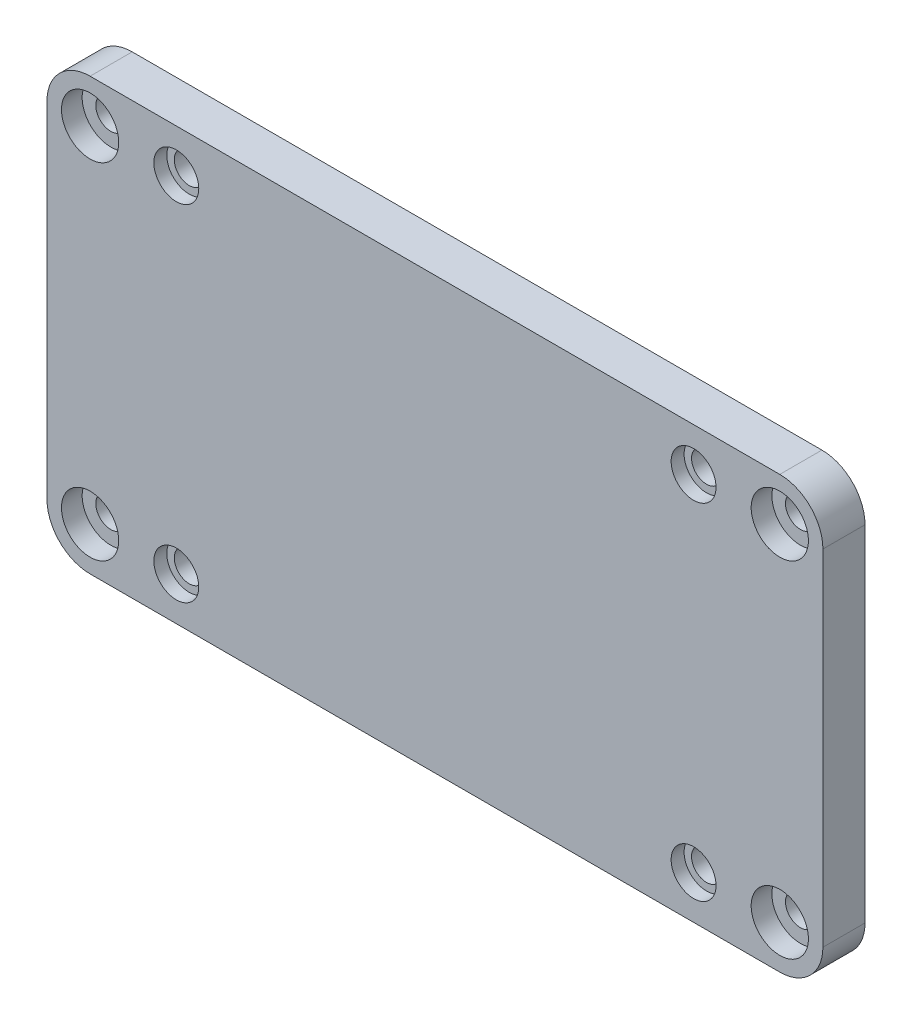
ISO-10303-21;
HEADER;
FILE_DESCRIPTION(('STEP AP214'),'2;1');
FILE_NAME('part.step','',(''),(''),'','','');
FILE_SCHEMA(('AUTOMOTIVE_DESIGN { 1 0 10303 214 1 1 1 1 }'));
ENDSEC;
DATA;
#1=APPLICATION_CONTEXT('core data for automotive mechanical design processes');
#2=APPLICATION_PROTOCOL_DEFINITION('international standard','automotive_design',2000,#1);
#3=PRODUCT_CONTEXT('',#1,'mechanical');
#4=PRODUCT('Part','Part','',(#3));
#5=PRODUCT_RELATED_PRODUCT_CATEGORY('part','',(#4));
#6=PRODUCT_DEFINITION_FORMATION('','',#4);
#7=PRODUCT_DEFINITION_CONTEXT('part definition',#1,'design');
#8=PRODUCT_DEFINITION('design','',#6,#7);
#9=PRODUCT_DEFINITION_SHAPE('','',#8);
#10=(LENGTH_UNIT() NAMED_UNIT(*) SI_UNIT(.MILLI.,.METRE.));
#11=(NAMED_UNIT(*) PLANE_ANGLE_UNIT() SI_UNIT($,.RADIAN.));
#12=(NAMED_UNIT(*) SI_UNIT($,.STERADIAN.) SOLID_ANGLE_UNIT());
#13=UNCERTAINTY_MEASURE_WITH_UNIT(LENGTH_MEASURE(1.E-05),#10,'distance_accuracy_value','');
#14=(GEOMETRIC_REPRESENTATION_CONTEXT(3) GLOBAL_UNCERTAINTY_ASSIGNED_CONTEXT((#13)) GLOBAL_UNIT_ASSIGNED_CONTEXT((#10,
#11,#12)) REPRESENTATION_CONTEXT('',''));
#15=CARTESIAN_POINT('',(0.,0.,0.));
#16=DIRECTION('',(0.,0.,1.));
#17=DIRECTION('',(1.,0.,0.));
#18=AXIS2_PLACEMENT_3D('',#15,#16,#17);
#19=CARTESIAN_POINT('',(-38.1,25.4,0.));
#20=DIRECTION('',(0.,0.,1.));
#21=DIRECTION('',(1.,0.,0.));
#22=AXIS2_PLACEMENT_3D('',#19,#20,#21);
#23=CYLINDRICAL_SURFACE('',#22,2.2098);
#24=CARTESIAN_POINT('',(-38.1,25.4,0.));
#25=DIRECTION('',(0.,0.,1.));
#26=DIRECTION('',(1.,0.,0.));
#27=AXIS2_PLACEMENT_3D('',#24,#25,#26);
#28=CIRCLE('',#27,2.2098);
#29=CARTESIAN_POINT('',(-35.8902,25.4,0.));
#30=VERTEX_POINT('',#29);
#31=EDGE_CURVE('E235',#30,#30,#28,.T.);
#32=ORIENTED_EDGE('',*,*,#31,.F.);
#33=EDGE_LOOP('',(#32));
#34=FACE_BOUND('',#33,.T.);
#35=CARTESIAN_POINT('',(-38.1,25.4,4.296000044));
#36=DIRECTION('',(0.,0.,1.));
#37=DIRECTION('',(1.,0.,0.));
#38=AXIS2_PLACEMENT_3D('',#35,#36,#37);
#39=CIRCLE('',#38,2.2098);
#40=CARTESIAN_POINT('',(-35.8902,25.4,4.296000044));
#41=VERTEX_POINT('',#40);
#42=EDGE_CURVE('E46',#41,#41,#39,.F.);
#43=ORIENTED_EDGE('',*,*,#42,.F.);
#44=EDGE_LOOP('',(#43));
#45=FACE_BOUND('',#44,.T.);
#46=ADVANCED_FACE('F42',(#34,#45),#23,.F.);
#47=CARTESIAN_POINT('',(38.1,25.4,0.));
#48=DIRECTION('',(0.,0.,1.));
#49=DIRECTION('',(1.,0.,0.));
#50=AXIS2_PLACEMENT_3D('',#47,#48,#49);
#51=CYLINDRICAL_SURFACE('',#50,2.2098);
#52=CARTESIAN_POINT('',(38.1,25.4,0.));
#53=DIRECTION('',(0.,0.,1.));
#54=DIRECTION('',(-1.,0.,0.));
#55=AXIS2_PLACEMENT_3D('',#52,#53,#54);
#56=CIRCLE('',#55,2.2098);
#57=CARTESIAN_POINT('',(35.8902,25.4,0.));
#58=VERTEX_POINT('',#57);
#59=EDGE_CURVE('E231',#58,#58,#56,.T.);
#60=ORIENTED_EDGE('',*,*,#59,.F.);
#61=EDGE_LOOP('',(#60));
#62=FACE_BOUND('',#61,.T.);
#63=CARTESIAN_POINT('',(38.1,25.4,4.296000044));
#64=DIRECTION('',(0.,0.,1.));
#65=DIRECTION('',(1.,0.,0.));
#66=AXIS2_PLACEMENT_3D('',#63,#64,#65);
#67=CIRCLE('',#66,2.2098);
#68=CARTESIAN_POINT('',(40.3098,25.4,4.296000044));
#69=VERTEX_POINT('',#68);
#70=EDGE_CURVE('E213',#69,#69,#67,.F.);
#71=ORIENTED_EDGE('',*,*,#70,.F.);
#72=EDGE_LOOP('',(#71));
#73=FACE_BOUND('',#72,.T.);
#74=ADVANCED_FACE('F368',(#62,#73),#51,.F.);
#75=CARTESIAN_POINT('',(38.1,-25.4,0.));
#76=DIRECTION('',(0.,0.,1.));
#77=DIRECTION('',(1.,0.,0.));
#78=AXIS2_PLACEMENT_3D('',#75,#76,#77);
#79=CYLINDRICAL_SURFACE('',#78,2.2098);
#80=CARTESIAN_POINT('',(38.1,-25.4,0.));
#81=DIRECTION('',(0.,0.,1.));
#82=DIRECTION('',(1.,0.,0.));
#83=AXIS2_PLACEMENT_3D('',#80,#81,#82);
#84=CIRCLE('',#83,2.2098);
#85=CARTESIAN_POINT('',(40.3098,-25.4,0.));
#86=VERTEX_POINT('',#85);
#87=EDGE_CURVE('E225',#86,#86,#84,.T.);
#88=ORIENTED_EDGE('',*,*,#87,.F.);
#89=EDGE_LOOP('',(#88));
#90=FACE_BOUND('',#89,.T.);
#91=CARTESIAN_POINT('',(38.1,-25.4,4.296000044));
#92=DIRECTION('',(0.,0.,1.));
#93=DIRECTION('',(1.,0.,0.));
#94=AXIS2_PLACEMENT_3D('',#91,#92,#93);
#95=CIRCLE('',#94,2.2098);
#96=CARTESIAN_POINT('',(40.3098,-25.4,4.296000044));
#97=VERTEX_POINT('',#96);
#98=EDGE_CURVE('E209',#97,#97,#95,.F.);
#99=ORIENTED_EDGE('',*,*,#98,.F.);
#100=EDGE_LOOP('',(#99));
#101=FACE_BOUND('',#100,.T.);
#102=ADVANCED_FACE('F375',(#90,#101),#79,.F.);
#103=CARTESIAN_POINT('',(-38.1,-25.4,0.));
#104=DIRECTION('',(0.,0.,1.));
#105=DIRECTION('',(1.,0.,0.));
#106=AXIS2_PLACEMENT_3D('',#103,#104,#105);
#107=CYLINDRICAL_SURFACE('',#106,2.2098);
#108=CARTESIAN_POINT('',(-38.1,-25.4,0.));
#109=DIRECTION('',(0.,0.,1.));
#110=DIRECTION('',(-1.,0.,0.));
#111=AXIS2_PLACEMENT_3D('',#108,#109,#110);
#112=CIRCLE('',#111,2.2098);
#113=CARTESIAN_POINT('',(-40.3098,-25.4,0.));
#114=VERTEX_POINT('',#113);
#115=EDGE_CURVE('E220',#114,#114,#112,.T.);
#116=ORIENTED_EDGE('',*,*,#115,.F.);
#117=EDGE_LOOP('',(#116));
#118=FACE_BOUND('',#117,.T.);
#119=CARTESIAN_POINT('',(-38.1,-25.4,4.296000044));
#120=DIRECTION('',(0.,0.,1.));
#121=DIRECTION('',(1.,0.,0.));
#122=AXIS2_PLACEMENT_3D('',#119,#120,#121);
#123=CIRCLE('',#122,2.2098);
#124=CARTESIAN_POINT('',(-35.8902,-25.4,4.296000044));
#125=VERTEX_POINT('',#124);
#126=EDGE_CURVE('E205',#125,#125,#123,.F.);
#127=ORIENTED_EDGE('',*,*,#126,.F.);
#128=EDGE_LOOP('',(#127));
#129=FACE_BOUND('',#128,.T.);
#130=ADVANCED_FACE('F382',(#118,#129),#107,.F.);
#131=CARTESIAN_POINT('',(-50.8,-25.4,6.20300004));
#132=DIRECTION('',(0.,0.,-1.));
#133=DIRECTION('',(-1.,0.,0.));
#134=AXIS2_PLACEMENT_3D('',#131,#132,#133);
#135=CYLINDRICAL_SURFACE('',#134,2.2098);
#136=CARTESIAN_POINT('',(-50.8,-25.4,0.));
#137=DIRECTION('',(0.,0.,1.));
#138=DIRECTION('',(1.,0.,0.));
#139=AXIS2_PLACEMENT_3D('',#136,#137,#138);
#140=CIRCLE('',#139,2.2098);
#141=CARTESIAN_POINT('',(-48.5902,-25.4,0.));
#142=VERTEX_POINT('',#141);
#143=EDGE_CURVE('E151',#142,#142,#140,.T.);
#144=ORIENTED_EDGE('',*,*,#143,.F.);
#145=EDGE_LOOP('',(#144));
#146=FACE_BOUND('',#145,.T.);
#147=CARTESIAN_POINT('',(-50.8,-25.4,3.15500004));
#148=DIRECTION('',(0.,0.,1.));
#149=DIRECTION('',(1.,0.,0.));
#150=AXIS2_PLACEMENT_3D('',#147,#148,#149);
#151=CIRCLE('',#150,2.2098);
#152=CARTESIAN_POINT('',(-48.5902,-25.4,3.15500004));
#153=VERTEX_POINT('',#152);
#154=EDGE_CURVE('E200',#153,#153,#151,.T.);
#155=ORIENTED_EDGE('',*,*,#154,.T.);
#156=EDGE_LOOP('',(#155));
#157=FACE_BOUND('',#156,.T.);
#158=ADVANCED_FACE('F415',(#146,#157),#135,.F.);
#159=CARTESIAN_POINT('',(-50.8,25.4,6.20300004));
#160=DIRECTION('',(0.,0.,-1.));
#161=DIRECTION('',(-1.,0.,0.));
#162=AXIS2_PLACEMENT_3D('',#159,#160,#161);
#163=CYLINDRICAL_SURFACE('',#162,2.2098);
#164=CARTESIAN_POINT('',(-50.8,25.4,0.));
#165=DIRECTION('',(0.,0.,1.));
#166=DIRECTION('',(1.,0.,0.));
#167=AXIS2_PLACEMENT_3D('',#164,#165,#166);
#168=CIRCLE('',#167,2.2098);
#169=CARTESIAN_POINT('',(-48.5902,25.4,0.));
#170=VERTEX_POINT('',#169);
#171=EDGE_CURVE('E277',#170,#170,#168,.T.);
#172=ORIENTED_EDGE('',*,*,#171,.F.);
#173=EDGE_LOOP('',(#172));
#174=FACE_BOUND('',#173,.T.);
#175=CARTESIAN_POINT('',(-50.8,25.4,3.15500004));
#176=DIRECTION('',(0.,0.,1.));
#177=DIRECTION('',(1.,0.,0.));
#178=AXIS2_PLACEMENT_3D('',#175,#176,#177);
#179=CIRCLE('',#178,2.2098);
#180=CARTESIAN_POINT('',(-48.5902,25.4,3.15500004));
#181=VERTEX_POINT('',#180);
#182=EDGE_CURVE('E196',#181,#181,#179,.T.);
#183=ORIENTED_EDGE('',*,*,#182,.T.);
#184=EDGE_LOOP('',(#183));
#185=FACE_BOUND('',#184,.T.);
#186=ADVANCED_FACE('F417',(#174,#185),#163,.F.);
#187=CARTESIAN_POINT('',(50.8,25.4,6.20300004));
#188=DIRECTION('',(0.,0.,-1.));
#189=DIRECTION('',(-1.,0.,0.));
#190=AXIS2_PLACEMENT_3D('',#187,#188,#189);
#191=CYLINDRICAL_SURFACE('',#190,2.2098);
#192=CARTESIAN_POINT('',(50.8,25.4,0.));
#193=DIRECTION('',(0.,0.,1.));
#194=DIRECTION('',(1.,0.,0.));
#195=AXIS2_PLACEMENT_3D('',#192,#193,#194);
#196=CIRCLE('',#195,2.2098);
#197=CARTESIAN_POINT('',(53.0098,25.4,0.));
#198=VERTEX_POINT('',#197);
#199=EDGE_CURVE('E273',#198,#198,#196,.T.);
#200=ORIENTED_EDGE('',*,*,#199,.F.);
#201=EDGE_LOOP('',(#200));
#202=FACE_BOUND('',#201,.T.);
#203=CARTESIAN_POINT('',(50.8,25.4,3.15500004));
#204=DIRECTION('',(0.,0.,1.));
#205=DIRECTION('',(1.,0.,0.));
#206=AXIS2_PLACEMENT_3D('',#203,#204,#205);
#207=CIRCLE('',#206,2.2098);
#208=CARTESIAN_POINT('',(53.0098,25.4,3.15500004));
#209=VERTEX_POINT('',#208);
#210=EDGE_CURVE('E191',#209,#209,#207,.T.);
#211=ORIENTED_EDGE('',*,*,#210,.T.);
#212=EDGE_LOOP('',(#211));
#213=FACE_BOUND('',#212,.T.);
#214=ADVANCED_FACE('F423',(#202,#213),#191,.F.);
#215=CARTESIAN_POINT('',(50.8,-25.4,6.20300004));
#216=DIRECTION('',(0.,0.,-1.));
#217=DIRECTION('',(-1.,0.,0.));
#218=AXIS2_PLACEMENT_3D('',#215,#216,#217);
#219=CYLINDRICAL_SURFACE('',#218,2.2098);
#220=CARTESIAN_POINT('',(50.8,-25.4,0.));
#221=DIRECTION('',(0.,0.,1.));
#222=DIRECTION('',(1.,0.,0.));
#223=AXIS2_PLACEMENT_3D('',#220,#221,#222);
#224=CIRCLE('',#223,2.2098);
#225=CARTESIAN_POINT('',(53.0098,-25.4,0.));
#226=VERTEX_POINT('',#225);
#227=EDGE_CURVE('E204',#226,#226,#224,.T.);
#228=ORIENTED_EDGE('',*,*,#227,.F.);
#229=EDGE_LOOP('',(#228));
#230=FACE_BOUND('',#229,.T.);
#231=CARTESIAN_POINT('',(50.8,-25.4,3.15500004));
#232=DIRECTION('',(0.,0.,1.));
#233=DIRECTION('',(1.,0.,0.));
#234=AXIS2_PLACEMENT_3D('',#231,#232,#233);
#235=CIRCLE('',#234,2.2098);
#236=CARTESIAN_POINT('',(53.0098,-25.4,3.15500004));
#237=VERTEX_POINT('',#236);
#238=EDGE_CURVE('E187',#237,#237,#235,.T.);
#239=ORIENTED_EDGE('',*,*,#238,.T.);
#240=EDGE_LOOP('',(#239));
#241=FACE_BOUND('',#240,.T.);
#242=ADVANCED_FACE('F336',(#230,#241),#219,.F.);
#243=CARTESIAN_POINT('',(50.8,-25.4,6.20300004));
#244=DIRECTION('',(0.,0.,1.));
#245=DIRECTION('',(1.,0.,0.));
#246=AXIS2_PLACEMENT_3D('',#243,#244,#245);
#247=PLANE('',#246);
#248=CARTESIAN_POINT('',(-38.1,-25.4,6.20300004));
#249=DIRECTION('',(0.,0.,1.));
#250=DIRECTION('',(1.,0.,0.));
#251=AXIS2_PLACEMENT_3D('',#248,#249,#250);
#252=CIRCLE('',#251,3.30699999000001);
#253=CARTESIAN_POINT('',(-34.79300001,-25.4,6.20300004));
#254=VERTEX_POINT('',#253);
#255=EDGE_CURVE('E311',#254,#254,#252,.T.);
#256=ORIENTED_EDGE('',*,*,#255,.F.);
#257=EDGE_LOOP('',(#256));
#258=FACE_BOUND('',#257,.T.);
#259=CARTESIAN_POINT('',(38.1,-25.4,6.20300004));
#260=DIRECTION('',(0.,0.,1.));
#261=DIRECTION('',(1.,0.,0.));
#262=AXIS2_PLACEMENT_3D('',#259,#260,#261);
#263=CIRCLE('',#262,3.30699999000001);
#264=CARTESIAN_POINT('',(41.40699999,-25.4,6.20300004));
#265=VERTEX_POINT('',#264);
#266=EDGE_CURVE('E319',#265,#265,#263,.T.);
#267=ORIENTED_EDGE('',*,*,#266,.F.);
#268=EDGE_LOOP('',(#267));
#269=FACE_BOUND('',#268,.T.);
#270=CARTESIAN_POINT('',(38.1,25.4,6.20300004));
#271=DIRECTION('',(0.,0.,1.));
#272=DIRECTION('',(1.,0.,0.));
#273=AXIS2_PLACEMENT_3D('',#270,#271,#272);
#274=CIRCLE('',#273,3.30699999000001);
#275=CARTESIAN_POINT('',(41.40699999,25.4,6.20300004));
#276=VERTEX_POINT('',#275);
#277=EDGE_CURVE('E303',#276,#276,#274,.T.);
#278=ORIENTED_EDGE('',*,*,#277,.F.);
#279=EDGE_LOOP('',(#278));
#280=FACE_BOUND('',#279,.T.);
#281=CARTESIAN_POINT('',(-38.1,25.4,6.20300004));
#282=DIRECTION('',(0.,0.,1.));
#283=DIRECTION('',(1.,0.,0.));
#284=AXIS2_PLACEMENT_3D('',#281,#282,#283);
#285=CIRCLE('',#284,3.30699999000001);
#286=CARTESIAN_POINT('',(-34.79300001,25.4,6.20300004));
#287=VERTEX_POINT('',#286);
#288=EDGE_CURVE('E299',#287,#287,#285,.T.);
#289=ORIENTED_EDGE('',*,*,#288,.F.);
#290=EDGE_LOOP('',(#289));
#291=FACE_BOUND('',#290,.T.);
#292=CARTESIAN_POINT('',(-50.8,-25.4,6.20300004));
#293=DIRECTION('',(0.,0.,1.));
#294=DIRECTION('',(1.,0.,0.));
#295=AXIS2_PLACEMENT_3D('',#292,#293,#294);
#296=CIRCLE('',#295,4.2164);
#297=CARTESIAN_POINT('',(-46.5836,-25.4,6.20300004));
#298=VERTEX_POINT('',#297);
#299=EDGE_CURVE('E257',#298,#298,#296,.T.);
#300=ORIENTED_EDGE('',*,*,#299,.F.);
#301=EDGE_LOOP('',(#300));
#302=FACE_BOUND('',#301,.T.);
#303=CARTESIAN_POINT('',(50.8,-25.4,6.20300004));
#304=DIRECTION('',(0.,0.,1.));
#305=DIRECTION('',(1.,0.,0.));
#306=AXIS2_PLACEMENT_3D('',#303,#304,#305);
#307=CIRCLE('',#306,4.2164);
#308=CARTESIAN_POINT('',(55.0164,-25.4,6.20300004));
#309=VERTEX_POINT('',#308);
#310=EDGE_CURVE('E249',#309,#309,#307,.T.);
#311=ORIENTED_EDGE('',*,*,#310,.F.);
#312=EDGE_LOOP('',(#311));
#313=FACE_BOUND('',#312,.T.);
#314=CARTESIAN_POINT('',(50.8,25.4,6.20300004));
#315=DIRECTION('',(0.,0.,1.));
#316=DIRECTION('',(1.,0.,0.));
#317=AXIS2_PLACEMENT_3D('',#314,#315,#316);
#318=CIRCLE('',#317,4.2164);
#319=CARTESIAN_POINT('',(55.0164,25.4,6.20300004));
#320=VERTEX_POINT('',#319);
#321=EDGE_CURVE('E240',#320,#320,#318,.T.);
#322=ORIENTED_EDGE('',*,*,#321,.F.);
#323=EDGE_LOOP('',(#322));
#324=FACE_BOUND('',#323,.T.);
#325=CARTESIAN_POINT('',(-50.8,25.4,6.20300004));
#326=DIRECTION('',(0.,0.,1.));
#327=DIRECTION('',(1.,0.,0.));
#328=AXIS2_PLACEMENT_3D('',#325,#326,#327);
#329=CIRCLE('',#328,4.2164);
#330=CARTESIAN_POINT('',(-46.5836,25.4,6.20300004));
#331=VERTEX_POINT('',#330);
#332=EDGE_CURVE('E244',#331,#331,#329,.T.);
#333=ORIENTED_EDGE('',*,*,#332,.F.);
#334=EDGE_LOOP('',(#333));
#335=FACE_BOUND('',#334,.T.);
#336=CARTESIAN_POINT('',(50.8,-25.4,6.20300004));
#337=DIRECTION('',(0.,0.,1.));
#338=DIRECTION('',(1.,0.,0.));
#339=AXIS2_PLACEMENT_3D('',#336,#337,#338);
#340=CIRCLE('',#339,6.34999999999999);
#341=CARTESIAN_POINT('',(50.8,-31.75,6.20300004));
#342=VERTEX_POINT('',#341);
#343=CARTESIAN_POINT('',(57.15,-25.4,6.20300004));
#344=VERTEX_POINT('',#343);
#345=EDGE_CURVE('E169',#342,#344,#340,.T.);
#346=ORIENTED_EDGE('',*,*,#345,.T.);
#347=DIRECTION('',(0.,1.,0.));
#348=VECTOR('',#347,1.);
#349=CARTESIAN_POINT('',(57.15,-25.4,6.20300004));
#350=LINE('',#349,#348);
#351=CARTESIAN_POINT('',(57.15,25.4,6.20300004));
#352=VERTEX_POINT('',#351);
#353=EDGE_CURVE('E105',#344,#352,#350,.T.);
#354=ORIENTED_EDGE('',*,*,#353,.T.);
#355=CARTESIAN_POINT('',(50.8,25.4,6.20300004));
#356=DIRECTION('',(0.,0.,1.));
#357=DIRECTION('',(-1.,0.,0.));
#358=AXIS2_PLACEMENT_3D('',#355,#356,#357);
#359=CIRCLE('',#358,6.35);
#360=CARTESIAN_POINT('',(50.8,31.75,6.20300004));
#361=VERTEX_POINT('',#360);
#362=EDGE_CURVE('E288',#352,#361,#359,.T.);
#363=ORIENTED_EDGE('',*,*,#362,.T.);
#364=DIRECTION('',(-1.,0.,0.));
#365=VECTOR('',#364,1.);
#366=CARTESIAN_POINT('',(-50.8,31.75,6.20300004));
#367=LINE('',#366,#365);
#368=CARTESIAN_POINT('',(-50.8,31.75,6.20300004));
#369=VERTEX_POINT('',#368);
#370=EDGE_CURVE('E291',#361,#369,#367,.T.);
#371=ORIENTED_EDGE('',*,*,#370,.T.);
#372=CARTESIAN_POINT('',(-50.8,25.4,6.20300004));
#373=DIRECTION('',(0.,0.,1.));
#374=DIRECTION('',(-1.,0.,0.));
#375=AXIS2_PLACEMENT_3D('',#372,#373,#374);
#376=CIRCLE('',#375,6.35);
#377=CARTESIAN_POINT('',(-57.15,25.4,6.20300004));
#378=VERTEX_POINT('',#377);
#379=EDGE_CURVE('E124',#369,#378,#376,.T.);
#380=ORIENTED_EDGE('',*,*,#379,.T.);
#381=DIRECTION('',(0.,-1.,0.));
#382=VECTOR('',#381,1.);
#383=CARTESIAN_POINT('',(-57.15,-25.4,6.20300004));
#384=LINE('',#383,#382);
#385=CARTESIAN_POINT('',(-57.15,-25.4,6.20300004));
#386=VERTEX_POINT('',#385);
#387=EDGE_CURVE('E118',#378,#386,#384,.T.);
#388=ORIENTED_EDGE('',*,*,#387,.T.);
#389=CARTESIAN_POINT('',(-50.8,-25.4,6.20300004));
#390=DIRECTION('',(0.,0.,1.));
#391=DIRECTION('',(-1.,0.,0.));
#392=AXIS2_PLACEMENT_3D('',#389,#390,#391);
#393=CIRCLE('',#392,6.34999999999999);
#394=CARTESIAN_POINT('',(-50.8,-31.75,6.20300004));
#395=VERTEX_POINT('',#394);
#396=EDGE_CURVE('E122',#386,#395,#393,.T.);
#397=ORIENTED_EDGE('',*,*,#396,.T.);
#398=DIRECTION('',(1.,0.,0.));
#399=VECTOR('',#398,1.);
#400=CARTESIAN_POINT('',(-50.8,-31.75,6.20300004));
#401=LINE('',#400,#399);
#402=EDGE_CURVE('E62',#395,#342,#401,.T.);
#403=ORIENTED_EDGE('',*,*,#402,.T.);
#404=EDGE_LOOP('',(#346,#354,#363,#371,#380,#388,#397,#403));
#405=FACE_BOUND('',#404,.T.);
#406=ADVANCED_FACE('F120',(#258,#269,#280,#291,#302,#313,#324,#335,#405),#247,.T.);
#407=CARTESIAN_POINT('',(50.8,-25.4,0.));
#408=DIRECTION('',(0.,0.,1.));
#409=DIRECTION('',(1.,0.,0.));
#410=AXIS2_PLACEMENT_3D('',#407,#408,#409);
#411=PLANE('',#410);
#412=ORIENTED_EDGE('',*,*,#115,.T.);
#413=EDGE_LOOP('',(#412));
#414=FACE_BOUND('',#413,.T.);
#415=ORIENTED_EDGE('',*,*,#87,.T.);
#416=EDGE_LOOP('',(#415));
#417=FACE_BOUND('',#416,.T.);
#418=ORIENTED_EDGE('',*,*,#59,.T.);
#419=EDGE_LOOP('',(#418));
#420=FACE_BOUND('',#419,.T.);
#421=ORIENTED_EDGE('',*,*,#31,.T.);
#422=EDGE_LOOP('',(#421));
#423=FACE_BOUND('',#422,.T.);
#424=CARTESIAN_POINT('',(50.8,-25.4,0.));
#425=DIRECTION('',(0.,0.,1.));
#426=DIRECTION('',(1.,0.,0.));
#427=AXIS2_PLACEMENT_3D('',#424,#425,#426);
#428=CIRCLE('',#427,6.34999999999999);
#429=CARTESIAN_POINT('',(50.8,-31.75,0.));
#430=VERTEX_POINT('',#429);
#431=CARTESIAN_POINT('',(57.15,-25.4,0.));
#432=VERTEX_POINT('',#431);
#433=EDGE_CURVE('E146',#430,#432,#428,.T.);
#434=ORIENTED_EDGE('',*,*,#433,.F.);
#435=DIRECTION('',(1.,0.,0.));
#436=VECTOR('',#435,1.);
#437=CARTESIAN_POINT('',(-50.8,-31.75,0.));
#438=LINE('',#437,#436);
#439=CARTESIAN_POINT('',(-50.8,-31.75,0.));
#440=VERTEX_POINT('',#439);
#441=EDGE_CURVE('E97',#440,#430,#438,.T.);
#442=ORIENTED_EDGE('',*,*,#441,.F.);
#443=CARTESIAN_POINT('',(-50.8,-25.4,0.));
#444=DIRECTION('',(0.,0.,1.));
#445=DIRECTION('',(-1.,0.,0.));
#446=AXIS2_PLACEMENT_3D('',#443,#444,#445);
#447=CIRCLE('',#446,6.34999999999999);
#448=CARTESIAN_POINT('',(-57.15,-25.4,0.));
#449=VERTEX_POINT('',#448);
#450=EDGE_CURVE('E91',#449,#440,#447,.T.);
#451=ORIENTED_EDGE('',*,*,#450,.F.);
#452=DIRECTION('',(0.,-1.,0.));
#453=VECTOR('',#452,1.);
#454=CARTESIAN_POINT('',(-57.15,-25.4,0.));
#455=LINE('',#454,#453);
#456=CARTESIAN_POINT('',(-57.15,25.4,0.));
#457=VERTEX_POINT('',#456);
#458=EDGE_CURVE('E133',#457,#449,#455,.T.);
#459=ORIENTED_EDGE('',*,*,#458,.F.);
#460=CARTESIAN_POINT('',(-50.8,25.4,0.));
#461=DIRECTION('',(0.,0.,1.));
#462=DIRECTION('',(-1.,0.,0.));
#463=AXIS2_PLACEMENT_3D('',#460,#461,#462);
#464=CIRCLE('',#463,6.35);
#465=CARTESIAN_POINT('',(-50.8,31.75,0.));
#466=VERTEX_POINT('',#465);
#467=EDGE_CURVE('E160',#466,#457,#464,.T.);
#468=ORIENTED_EDGE('',*,*,#467,.F.);
#469=DIRECTION('',(-1.,0.,0.));
#470=VECTOR('',#469,1.);
#471=CARTESIAN_POINT('',(-50.8,31.75,0.));
#472=LINE('',#471,#470);
#473=CARTESIAN_POINT('',(50.8,31.75,0.));
#474=VERTEX_POINT('',#473);
#475=EDGE_CURVE('E157',#474,#466,#472,.T.);
#476=ORIENTED_EDGE('',*,*,#475,.F.);
#477=CARTESIAN_POINT('',(50.8,25.4,0.));
#478=DIRECTION('',(0.,0.,1.));
#479=DIRECTION('',(-1.,0.,0.));
#480=AXIS2_PLACEMENT_3D('',#477,#478,#479);
#481=CIRCLE('',#480,6.35);
#482=CARTESIAN_POINT('',(57.15,25.4,0.));
#483=VERTEX_POINT('',#482);
#484=EDGE_CURVE('E154',#483,#474,#481,.T.);
#485=ORIENTED_EDGE('',*,*,#484,.F.);
#486=DIRECTION('',(0.,1.,0.));
#487=VECTOR('',#486,1.);
#488=CARTESIAN_POINT('',(57.15,-25.4,0.));
#489=LINE('',#488,#487);
#490=EDGE_CURVE('E150',#432,#483,#489,.T.);
#491=ORIENTED_EDGE('',*,*,#490,.F.);
#492=EDGE_LOOP('',(#434,#442,#451,#459,#468,#476,#485,#491));
#493=FACE_BOUND('',#492,.T.);
#494=ORIENTED_EDGE('',*,*,#143,.T.);
#495=EDGE_LOOP('',(#494));
#496=FACE_BOUND('',#495,.T.);
#497=ORIENTED_EDGE('',*,*,#171,.T.);
#498=EDGE_LOOP('',(#497));
#499=FACE_BOUND('',#498,.T.);
#500=ORIENTED_EDGE('',*,*,#199,.T.);
#501=EDGE_LOOP('',(#500));
#502=FACE_BOUND('',#501,.T.);
#503=ORIENTED_EDGE('',*,*,#227,.T.);
#504=EDGE_LOOP('',(#503));
#505=FACE_BOUND('',#504,.T.);
#506=ADVANCED_FACE('F335',(#414,#417,#420,#423,#493,#496,#499,#502,#505),#411,.F.);
#507=CARTESIAN_POINT('',(50.8,-25.4,6.20300004));
#508=DIRECTION('',(0.,0.,-1.));
#509=DIRECTION('',(-1.,0.,0.));
#510=AXIS2_PLACEMENT_3D('',#507,#508,#509);
#511=CYLINDRICAL_SURFACE('',#510,6.34999999999999);
#512=ORIENTED_EDGE('',*,*,#433,.T.);
#513=DIRECTION('',(0.,0.,-1.));
#514=VECTOR('',#513,1.);
#515=CARTESIAN_POINT('',(57.15,-25.4,6.20300004));
#516=LINE('',#515,#514);
#517=EDGE_CURVE('E11',#344,#432,#516,.T.);
#518=ORIENTED_EDGE('',*,*,#517,.F.);
#519=ORIENTED_EDGE('',*,*,#345,.F.);
#520=DIRECTION('',(0.,0.,-1.));
#521=VECTOR('',#520,1.);
#522=CARTESIAN_POINT('',(50.8,-31.75,6.20300004));
#523=LINE('',#522,#521);
#524=EDGE_CURVE('E142',#342,#430,#523,.T.);
#525=ORIENTED_EDGE('',*,*,#524,.T.);
#526=EDGE_LOOP('',(#512,#518,#519,#525));
#527=FACE_BOUND('',#526,.T.);
#528=ADVANCED_FACE('F44',(#527),#511,.T.);
#529=CARTESIAN_POINT('',(57.15,-25.4,6.20300004));
#530=DIRECTION('',(-1.,0.,0.));
#531=DIRECTION('',(0.,0.,1.));
#532=AXIS2_PLACEMENT_3D('',#529,#530,#531);
#533=PLANE('',#532);
#534=ORIENTED_EDGE('',*,*,#490,.T.);
#535=DIRECTION('',(0.,0.,-1.));
#536=VECTOR('',#535,1.);
#537=CARTESIAN_POINT('',(57.15,25.4,6.20300004));
#538=LINE('',#537,#536);
#539=EDGE_CURVE('E53',#352,#483,#538,.T.);
#540=ORIENTED_EDGE('',*,*,#539,.F.);
#541=ORIENTED_EDGE('',*,*,#353,.F.);
#542=ORIENTED_EDGE('',*,*,#517,.T.);
#543=EDGE_LOOP('',(#534,#540,#541,#542));
#544=FACE_BOUND('',#543,.T.);
#545=ADVANCED_FACE('F449',(#544),#533,.F.);
#546=CARTESIAN_POINT('',(50.8,25.4,6.20300004));
#547=DIRECTION('',(0.,0.,-1.));
#548=DIRECTION('',(-1.,0.,0.));
#549=AXIS2_PLACEMENT_3D('',#546,#547,#548);
#550=CYLINDRICAL_SURFACE('',#549,6.35);
#551=ORIENTED_EDGE('',*,*,#484,.T.);
#552=DIRECTION('',(0.,0.,-1.));
#553=VECTOR('',#552,1.);
#554=CARTESIAN_POINT('',(50.8,31.75,6.20300004));
#555=LINE('',#554,#553);
#556=EDGE_CURVE('E180',#361,#474,#555,.T.);
#557=ORIENTED_EDGE('',*,*,#556,.F.);
#558=ORIENTED_EDGE('',*,*,#362,.F.);
#559=ORIENTED_EDGE('',*,*,#539,.T.);
#560=EDGE_LOOP('',(#551,#557,#558,#559));
#561=FACE_BOUND('',#560,.T.);
#562=ADVANCED_FACE('F446',(#561),#550,.T.);
#563=CARTESIAN_POINT('',(-50.8,31.75,6.20300004));
#564=DIRECTION('',(0.,-1.,0.));
#565=DIRECTION('',(0.,0.,-1.));
#566=AXIS2_PLACEMENT_3D('',#563,#564,#565);
#567=PLANE('',#566);
#568=ORIENTED_EDGE('',*,*,#475,.T.);
#569=DIRECTION('',(0.,0.,-1.));
#570=VECTOR('',#569,1.);
#571=CARTESIAN_POINT('',(-50.8,31.75,6.20300004));
#572=LINE('',#571,#570);
#573=EDGE_CURVE('E176',#369,#466,#572,.T.);
#574=ORIENTED_EDGE('',*,*,#573,.F.);
#575=ORIENTED_EDGE('',*,*,#370,.F.);
#576=ORIENTED_EDGE('',*,*,#556,.T.);
#577=EDGE_LOOP('',(#568,#574,#575,#576));
#578=FACE_BOUND('',#577,.T.);
#579=ADVANCED_FACE('F442',(#578),#567,.F.);
#580=CARTESIAN_POINT('',(-50.8,25.4,6.20300004));
#581=DIRECTION('',(0.,0.,-1.));
#582=DIRECTION('',(-1.,0.,0.));
#583=AXIS2_PLACEMENT_3D('',#580,#581,#582);
#584=CYLINDRICAL_SURFACE('',#583,6.35);
#585=ORIENTED_EDGE('',*,*,#467,.T.);
#586=DIRECTION('',(0.,0.,-1.));
#587=VECTOR('',#586,1.);
#588=CARTESIAN_POINT('',(-57.15,25.4,6.20300004));
#589=LINE('',#588,#587);
#590=EDGE_CURVE('E135',#378,#457,#589,.T.);
#591=ORIENTED_EDGE('',*,*,#590,.F.);
#592=ORIENTED_EDGE('',*,*,#379,.F.);
#593=ORIENTED_EDGE('',*,*,#573,.T.);
#594=EDGE_LOOP('',(#585,#591,#592,#593));
#595=FACE_BOUND('',#594,.T.);
#596=ADVANCED_FACE('F439',(#595),#584,.T.);
#597=CARTESIAN_POINT('',(-57.15,-25.4,6.20300004));
#598=DIRECTION('',(1.,0.,0.));
#599=DIRECTION('',(0.,0.,-1.));
#600=AXIS2_PLACEMENT_3D('',#597,#598,#599);
#601=PLANE('',#600);
#602=ORIENTED_EDGE('',*,*,#458,.T.);
#603=DIRECTION('',(0.,0.,-1.));
#604=VECTOR('',#603,1.);
#605=CARTESIAN_POINT('',(-57.15,-25.4,6.20300004));
#606=LINE('',#605,#604);
#607=EDGE_CURVE('E130',#386,#449,#606,.T.);
#608=ORIENTED_EDGE('',*,*,#607,.F.);
#609=ORIENTED_EDGE('',*,*,#387,.F.);
#610=ORIENTED_EDGE('',*,*,#590,.T.);
#611=EDGE_LOOP('',(#602,#608,#609,#610));
#612=FACE_BOUND('',#611,.T.);
#613=ADVANCED_FACE('F131',(#612),#601,.F.);
#614=CARTESIAN_POINT('',(-50.8,-25.4,6.20300004));
#615=DIRECTION('',(0.,0.,-1.));
#616=DIRECTION('',(-1.,0.,0.));
#617=AXIS2_PLACEMENT_3D('',#614,#615,#616);
#618=CYLINDRICAL_SURFACE('',#617,6.34999999999999);
#619=ORIENTED_EDGE('',*,*,#450,.T.);
#620=DIRECTION('',(0.,0.,-1.));
#621=VECTOR('',#620,1.);
#622=CARTESIAN_POINT('',(-50.8,-31.75,6.20300004));
#623=LINE('',#622,#621);
#624=EDGE_CURVE('E136',#395,#440,#623,.T.);
#625=ORIENTED_EDGE('',*,*,#624,.F.);
#626=ORIENTED_EDGE('',*,*,#396,.F.);
#627=ORIENTED_EDGE('',*,*,#607,.T.);
#628=EDGE_LOOP('',(#619,#625,#626,#627));
#629=FACE_BOUND('',#628,.T.);
#630=ADVANCED_FACE('F138',(#629),#618,.T.);
#631=CARTESIAN_POINT('',(-50.8,-31.75,6.20300004));
#632=DIRECTION('',(0.,1.,0.));
#633=DIRECTION('',(0.,0.,1.));
#634=AXIS2_PLACEMENT_3D('',#631,#632,#633);
#635=PLANE('',#634);
#636=ORIENTED_EDGE('',*,*,#441,.T.);
#637=ORIENTED_EDGE('',*,*,#524,.F.);
#638=ORIENTED_EDGE('',*,*,#402,.F.);
#639=ORIENTED_EDGE('',*,*,#624,.T.);
#640=EDGE_LOOP('',(#636,#637,#638,#639));
#641=FACE_BOUND('',#640,.T.);
#642=ADVANCED_FACE('F391',(#641),#635,.F.);
#643=CARTESIAN_POINT('',(50.8,-25.4,3.15500004));
#644=DIRECTION('',(0.,0.,1.));
#645=DIRECTION('',(1.,0.,0.));
#646=AXIS2_PLACEMENT_3D('',#643,#644,#645);
#647=CYLINDRICAL_SURFACE('',#646,4.2164);
#648=CARTESIAN_POINT('',(50.8,-25.4,3.15500004));
#649=DIRECTION('',(0.,0.,1.));
#650=DIRECTION('',(1.,0.,0.));
#651=AXIS2_PLACEMENT_3D('',#648,#649,#650);
#652=CIRCLE('',#651,4.2164);
#653=CARTESIAN_POINT('',(55.0164,-25.4,3.15500004));
#654=VERTEX_POINT('',#653);
#655=EDGE_CURVE('E253',#654,#654,#652,.T.);
#656=ORIENTED_EDGE('',*,*,#655,.F.);
#657=EDGE_LOOP('',(#656));
#658=FACE_BOUND('',#657,.T.);
#659=ORIENTED_EDGE('',*,*,#310,.T.);
#660=EDGE_LOOP('',(#659));
#661=FACE_BOUND('',#660,.T.);
#662=ADVANCED_FACE('F388',(#658,#661),#647,.F.);
#663=CARTESIAN_POINT('',(50.8,-25.4,3.15500004));
#664=DIRECTION('',(0.,0.,1.));
#665=DIRECTION('',(1.,0.,0.));
#666=AXIS2_PLACEMENT_3D('',#663,#664,#665);
#667=PLANE('',#666);
#668=ORIENTED_EDGE('',*,*,#238,.F.);
#669=EDGE_LOOP('',(#668));
#670=FACE_BOUND('',#669,.T.);
#671=ORIENTED_EDGE('',*,*,#655,.T.);
#672=EDGE_LOOP('',(#671));
#673=FACE_BOUND('',#672,.T.);
#674=ADVANCED_FACE('F385',(#670,#673),#667,.T.);
#675=CARTESIAN_POINT('',(50.8,25.4,3.15500004));
#676=DIRECTION('',(0.,0.,1.));
#677=DIRECTION('',(1.,0.,0.));
#678=AXIS2_PLACEMENT_3D('',#675,#676,#677);
#679=CYLINDRICAL_SURFACE('',#678,4.2164);
#680=CARTESIAN_POINT('',(50.8,25.4,3.15500004));
#681=DIRECTION('',(0.,0.,1.));
#682=DIRECTION('',(1.,0.,0.));
#683=AXIS2_PLACEMENT_3D('',#680,#681,#682);
#684=CIRCLE('',#683,4.2164);
#685=CARTESIAN_POINT('',(55.0164,25.4,3.15500004));
#686=VERTEX_POINT('',#685);
#687=EDGE_CURVE('E245',#686,#686,#684,.T.);
#688=ORIENTED_EDGE('',*,*,#687,.F.);
#689=EDGE_LOOP('',(#688));
#690=FACE_BOUND('',#689,.T.);
#691=ORIENTED_EDGE('',*,*,#321,.T.);
#692=EDGE_LOOP('',(#691));
#693=FACE_BOUND('',#692,.T.);
#694=ADVANCED_FACE('F362',(#690,#693),#679,.F.);
#695=CARTESIAN_POINT('',(50.8,25.4,3.15500004));
#696=DIRECTION('',(0.,0.,1.));
#697=DIRECTION('',(1.,0.,0.));
#698=AXIS2_PLACEMENT_3D('',#695,#696,#697);
#699=PLANE('',#698);
#700=ORIENTED_EDGE('',*,*,#210,.F.);
#701=EDGE_LOOP('',(#700));
#702=FACE_BOUND('',#701,.T.);
#703=ORIENTED_EDGE('',*,*,#687,.T.);
#704=EDGE_LOOP('',(#703));
#705=FACE_BOUND('',#704,.T.);
#706=ADVANCED_FACE('F352',(#702,#705),#699,.T.);
#707=CARTESIAN_POINT('',(-50.8,25.4,3.15500004));
#708=DIRECTION('',(0.,0.,1.));
#709=DIRECTION('',(1.,0.,0.));
#710=AXIS2_PLACEMENT_3D('',#707,#708,#709);
#711=CYLINDRICAL_SURFACE('',#710,4.2164);
#712=CARTESIAN_POINT('',(-50.8,25.4,3.15500004));
#713=DIRECTION('',(0.,0.,1.));
#714=DIRECTION('',(1.,0.,0.));
#715=AXIS2_PLACEMENT_3D('',#712,#713,#714);
#716=CIRCLE('',#715,4.2164);
#717=CARTESIAN_POINT('',(-46.5836,25.4,3.15500004));
#718=VERTEX_POINT('',#717);
#719=EDGE_CURVE('E192',#718,#718,#716,.T.);
#720=ORIENTED_EDGE('',*,*,#719,.F.);
#721=EDGE_LOOP('',(#720));
#722=FACE_BOUND('',#721,.T.);
#723=ORIENTED_EDGE('',*,*,#332,.T.);
#724=EDGE_LOOP('',(#723));
#725=FACE_BOUND('',#724,.T.);
#726=ADVANCED_FACE('F349',(#722,#725),#711,.F.);
#727=CARTESIAN_POINT('',(-50.8,25.4,3.15500004));
#728=DIRECTION('',(0.,0.,1.));
#729=DIRECTION('',(1.,0.,0.));
#730=AXIS2_PLACEMENT_3D('',#727,#728,#729);
#731=PLANE('',#730);
#732=ORIENTED_EDGE('',*,*,#182,.F.);
#733=EDGE_LOOP('',(#732));
#734=FACE_BOUND('',#733,.T.);
#735=ORIENTED_EDGE('',*,*,#719,.T.);
#736=EDGE_LOOP('',(#735));
#737=FACE_BOUND('',#736,.T.);
#738=ADVANCED_FACE('F351',(#734,#737),#731,.T.);
#739=CARTESIAN_POINT('',(-50.8,-25.4,3.15500004));
#740=DIRECTION('',(0.,0.,1.));
#741=DIRECTION('',(1.,0.,0.));
#742=AXIS2_PLACEMENT_3D('',#739,#740,#741);
#743=CYLINDRICAL_SURFACE('',#742,4.2164);
#744=CARTESIAN_POINT('',(-50.8,-25.4,3.15500004));
#745=DIRECTION('',(0.,0.,1.));
#746=DIRECTION('',(1.,0.,0.));
#747=AXIS2_PLACEMENT_3D('',#744,#745,#746);
#748=CIRCLE('',#747,4.2164);
#749=CARTESIAN_POINT('',(-46.5836,-25.4,3.15500004));
#750=VERTEX_POINT('',#749);
#751=EDGE_CURVE('E239',#750,#750,#748,.T.);
#752=ORIENTED_EDGE('',*,*,#751,.F.);
#753=EDGE_LOOP('',(#752));
#754=FACE_BOUND('',#753,.T.);
#755=ORIENTED_EDGE('',*,*,#299,.T.);
#756=EDGE_LOOP('',(#755));
#757=FACE_BOUND('',#756,.T.);
#758=ADVANCED_FACE('F359',(#754,#757),#743,.F.);
#759=CARTESIAN_POINT('',(-50.8,-25.4,3.15500004));
#760=DIRECTION('',(0.,0.,1.));
#761=DIRECTION('',(1.,0.,0.));
#762=AXIS2_PLACEMENT_3D('',#759,#760,#761);
#763=PLANE('',#762);
#764=ORIENTED_EDGE('',*,*,#154,.F.);
#765=EDGE_LOOP('',(#764));
#766=FACE_BOUND('',#765,.T.);
#767=ORIENTED_EDGE('',*,*,#751,.T.);
#768=EDGE_LOOP('',(#767));
#769=FACE_BOUND('',#768,.T.);
#770=ADVANCED_FACE('F398',(#766,#769),#763,.T.);
#771=CARTESIAN_POINT('',(-38.1,-25.4,4.296000044));
#772=DIRECTION('',(0.,0.,1.));
#773=DIRECTION('',(1.,0.,0.));
#774=AXIS2_PLACEMENT_3D('',#771,#772,#773);
#775=PLANE('',#774);
#776=CARTESIAN_POINT('',(-38.1,-25.4,4.296000044));
#777=DIRECTION('',(0.,0.,1.));
#778=DIRECTION('',(1.,0.,0.));
#779=AXIS2_PLACEMENT_3D('',#776,#777,#778);
#780=CIRCLE('',#779,3.30699999000001);
#781=CARTESIAN_POINT('',(-34.79300001,-25.4,4.296000044));
#782=VERTEX_POINT('',#781);
#783=EDGE_CURVE('E307',#782,#782,#780,.T.);
#784=ORIENTED_EDGE('',*,*,#783,.T.);
#785=EDGE_LOOP('',(#784));
#786=FACE_BOUND('',#785,.T.);
#787=ORIENTED_EDGE('',*,*,#126,.T.);
#788=EDGE_LOOP('',(#787));
#789=FACE_BOUND('',#788,.T.);
#790=ADVANCED_FACE('F401',(#786,#789),#775,.T.);
#791=CARTESIAN_POINT('',(-38.1,-25.4,4.296000044));
#792=DIRECTION('',(0.,0.,1.));
#793=DIRECTION('',(1.,0.,0.));
#794=AXIS2_PLACEMENT_3D('',#791,#792,#793);
#795=CYLINDRICAL_SURFACE('',#794,3.30699999000001);
#796=ORIENTED_EDGE('',*,*,#783,.F.);
#797=EDGE_LOOP('',(#796));
#798=FACE_BOUND('',#797,.T.);
#799=ORIENTED_EDGE('',*,*,#255,.T.);
#800=EDGE_LOOP('',(#799));
#801=FACE_BOUND('',#800,.T.);
#802=ADVANCED_FACE('F407',(#798,#801),#795,.F.);
#803=CARTESIAN_POINT('',(38.1,-25.4,4.296000044));
#804=DIRECTION('',(0.,0.,1.));
#805=DIRECTION('',(1.,0.,0.));
#806=AXIS2_PLACEMENT_3D('',#803,#804,#805);
#807=PLANE('',#806);
#808=CARTESIAN_POINT('',(38.1,-25.4,4.296000044));
#809=DIRECTION('',(0.,0.,1.));
#810=DIRECTION('',(1.,0.,0.));
#811=AXIS2_PLACEMENT_3D('',#808,#809,#810);
#812=CIRCLE('',#811,3.30699999000001);
#813=CARTESIAN_POINT('',(41.40699999,-25.4,4.296000044));
#814=VERTEX_POINT('',#813);
#815=EDGE_CURVE('E315',#814,#814,#812,.T.);
#816=ORIENTED_EDGE('',*,*,#815,.T.);
#817=EDGE_LOOP('',(#816));
#818=FACE_BOUND('',#817,.T.);
#819=ORIENTED_EDGE('',*,*,#98,.T.);
#820=EDGE_LOOP('',(#819));
#821=FACE_BOUND('',#820,.T.);
#822=ADVANCED_FACE('F587',(#818,#821),#807,.T.);
#823=CARTESIAN_POINT('',(38.1,-25.4,4.296000044));
#824=DIRECTION('',(0.,0.,1.));
#825=DIRECTION('',(1.,0.,0.));
#826=AXIS2_PLACEMENT_3D('',#823,#824,#825);
#827=CYLINDRICAL_SURFACE('',#826,3.30699999000001);
#828=ORIENTED_EDGE('',*,*,#815,.F.);
#829=EDGE_LOOP('',(#828));
#830=FACE_BOUND('',#829,.T.);
#831=ORIENTED_EDGE('',*,*,#266,.T.);
#832=EDGE_LOOP('',(#831));
#833=FACE_BOUND('',#832,.T.);
#834=ADVANCED_FACE('F598',(#830,#833),#827,.F.);
#835=CARTESIAN_POINT('',(38.1,25.4,4.296000044));
#836=DIRECTION('',(0.,0.,1.));
#837=DIRECTION('',(1.,0.,0.));
#838=AXIS2_PLACEMENT_3D('',#835,#836,#837);
#839=PLANE('',#838);
#840=CARTESIAN_POINT('',(38.1,25.4,4.296000044));
#841=DIRECTION('',(0.,0.,1.));
#842=DIRECTION('',(1.,0.,0.));
#843=AXIS2_PLACEMENT_3D('',#840,#841,#842);
#844=CIRCLE('',#843,3.30699999000001);
#845=CARTESIAN_POINT('',(41.40699999,25.4,4.296000044));
#846=VERTEX_POINT('',#845);
#847=EDGE_CURVE('E323',#846,#846,#844,.T.);
#848=ORIENTED_EDGE('',*,*,#847,.T.);
#849=EDGE_LOOP('',(#848));
#850=FACE_BOUND('',#849,.T.);
#851=ORIENTED_EDGE('',*,*,#70,.T.);
#852=EDGE_LOOP('',(#851));
#853=FACE_BOUND('',#852,.T.);
#854=ADVANCED_FACE('F609',(#850,#853),#839,.T.);
#855=CARTESIAN_POINT('',(38.1,25.4,4.296000044));
#856=DIRECTION('',(0.,0.,1.));
#857=DIRECTION('',(1.,0.,0.));
#858=AXIS2_PLACEMENT_3D('',#855,#856,#857);
#859=CYLINDRICAL_SURFACE('',#858,3.30699999000001);
#860=ORIENTED_EDGE('',*,*,#847,.F.);
#861=EDGE_LOOP('',(#860));
#862=FACE_BOUND('',#861,.T.);
#863=ORIENTED_EDGE('',*,*,#277,.T.);
#864=EDGE_LOOP('',(#863));
#865=FACE_BOUND('',#864,.T.);
#866=ADVANCED_FACE('F331',(#862,#865),#859,.F.);
#867=CARTESIAN_POINT('',(-38.1,25.4,4.296000044));
#868=DIRECTION('',(0.,0.,1.));
#869=DIRECTION('',(1.,0.,0.));
#870=AXIS2_PLACEMENT_3D('',#867,#868,#869);
#871=PLANE('',#870);
#872=CARTESIAN_POINT('',(-38.1,25.4,4.296000044));
#873=DIRECTION('',(0.,0.,1.));
#874=DIRECTION('',(1.,0.,0.));
#875=AXIS2_PLACEMENT_3D('',#872,#873,#874);
#876=CIRCLE('',#875,3.30699999000001);
#877=CARTESIAN_POINT('',(-34.79300001,25.4,4.296000044));
#878=VERTEX_POINT('',#877);
#879=EDGE_CURVE('E210',#878,#878,#876,.T.);
#880=ORIENTED_EDGE('',*,*,#879,.T.);
#881=EDGE_LOOP('',(#880));
#882=FACE_BOUND('',#881,.T.);
#883=ORIENTED_EDGE('',*,*,#42,.T.);
#884=EDGE_LOOP('',(#883));
#885=FACE_BOUND('',#884,.T.);
#886=ADVANCED_FACE('F630',(#882,#885),#871,.T.);
#887=CARTESIAN_POINT('',(-38.1,25.4,4.296000044));
#888=DIRECTION('',(0.,0.,1.));
#889=DIRECTION('',(1.,0.,0.));
#890=AXIS2_PLACEMENT_3D('',#887,#888,#889);
#891=CYLINDRICAL_SURFACE('',#890,3.30699999000001);
#892=ORIENTED_EDGE('',*,*,#879,.F.);
#893=EDGE_LOOP('',(#892));
#894=FACE_BOUND('',#893,.T.);
#895=ORIENTED_EDGE('',*,*,#288,.T.);
#896=EDGE_LOOP('',(#895));
#897=FACE_BOUND('',#896,.T.);
#898=ADVANCED_FACE('F641',(#894,#897),#891,.F.);
#899=CLOSED_SHELL('',(#46,#74,#102,#130,#158,#186,#214,#242,#406,#506,#528,#545,#562,#579,#596,
#613,#630,#642,#662,#674,#694,#706,#726,#738,#758,#770,#790,#802,#822,#834,#854,#866,#886,#898));
#900=MANIFOLD_SOLID_BREP('B2',#899);
#901=ADVANCED_BREP_SHAPE_REPRESENTATION('',(#18,#900),#14);
#902=SHAPE_DEFINITION_REPRESENTATION(#9,#901);
ENDSEC;
END-ISO-10303-21;
